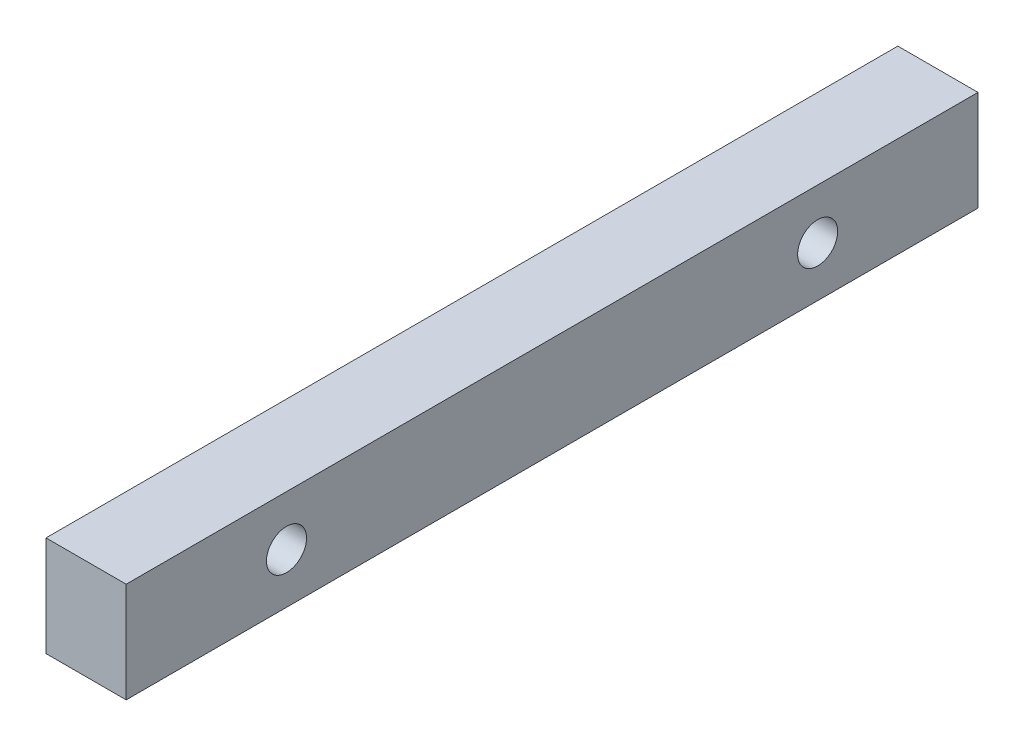
ISO-10303-21;
HEADER;
FILE_DESCRIPTION(('STEP AP214'),'2;1');
FILE_NAME('part.step','',(''),(''),'','','');
FILE_SCHEMA(('AUTOMOTIVE_DESIGN { 1 0 10303 214 1 1 1 1 }'));
ENDSEC;
DATA;
#1=APPLICATION_CONTEXT('core data for automotive mechanical design processes');
#2=APPLICATION_PROTOCOL_DEFINITION('international standard','automotive_design',2000,#1);
#3=PRODUCT_CONTEXT('',#1,'mechanical');
#4=PRODUCT('Part','Part','',(#3));
#5=PRODUCT_RELATED_PRODUCT_CATEGORY('part','',(#4));
#6=PRODUCT_DEFINITION_FORMATION('','',#4);
#7=PRODUCT_DEFINITION_CONTEXT('part definition',#1,'design');
#8=PRODUCT_DEFINITION('design','',#6,#7);
#9=PRODUCT_DEFINITION_SHAPE('','',#8);
#10=(LENGTH_UNIT() NAMED_UNIT(*) SI_UNIT(.MILLI.,.METRE.));
#11=(NAMED_UNIT(*) PLANE_ANGLE_UNIT() SI_UNIT($,.RADIAN.));
#12=(NAMED_UNIT(*) SI_UNIT($,.STERADIAN.) SOLID_ANGLE_UNIT());
#13=UNCERTAINTY_MEASURE_WITH_UNIT(LENGTH_MEASURE(1.E-05),#10,'distance_accuracy_value','');
#14=(GEOMETRIC_REPRESENTATION_CONTEXT(3) GLOBAL_UNCERTAINTY_ASSIGNED_CONTEXT((#13)) GLOBAL_UNIT_ASSIGNED_CONTEXT((#10,
#11,#12)) REPRESENTATION_CONTEXT('',''));
#15=CARTESIAN_POINT('',(0.,0.,0.));
#16=DIRECTION('',(0.,0.,1.));
#17=DIRECTION('',(1.,0.,0.));
#18=AXIS2_PLACEMENT_3D('',#15,#16,#17);
#19=CARTESIAN_POINT('',(30.,-20.,212.5));
#20=DIRECTION('',(-1.,0.,0.));
#21=DIRECTION('',(0.,0.,1.));
#22=AXIS2_PLACEMENT_3D('',#19,#20,#21);
#23=PLANE('',#22);
#24=CARTESIAN_POINT('',(30.,5.,132.5));
#25=DIRECTION('',(1.,0.,0.));
#26=DIRECTION('',(0.,0.,-1.));
#27=AXIS2_PLACEMENT_3D('',#24,#25,#26);
#28=CIRCLE('',#27,10.);
#29=CARTESIAN_POINT('',(30.,5.,122.5));
#30=VERTEX_POINT('',#29);
#31=EDGE_CURVE('E115',#30,#30,#28,.T.);
#32=ORIENTED_EDGE('',*,*,#31,.F.);
#33=EDGE_LOOP('',(#32));
#34=FACE_BOUND('',#33,.T.);
#35=CARTESIAN_POINT('',(30.,5.,-132.5));
#36=DIRECTION('',(1.,0.,0.));
#37=DIRECTION('',(0.,0.,-1.));
#38=AXIS2_PLACEMENT_3D('',#35,#36,#37);
#39=CIRCLE('',#38,10.);
#40=CARTESIAN_POINT('',(30.,5.,-142.5));
#41=VERTEX_POINT('',#40);
#42=EDGE_CURVE('E116',#41,#41,#39,.T.);
#43=ORIENTED_EDGE('',*,*,#42,.F.);
#44=EDGE_LOOP('',(#43));
#45=FACE_BOUND('',#44,.T.);
#46=DIRECTION('',(0.,1.,0.));
#47=VECTOR('',#46,1.);
#48=CARTESIAN_POINT('',(30.,-20.,-212.5));
#49=LINE('',#48,#47);
#50=CARTESIAN_POINT('',(30.,-20.,-212.5));
#51=VERTEX_POINT('',#50);
#52=CARTESIAN_POINT('',(30.,30.,-212.5));
#53=VERTEX_POINT('',#52);
#54=EDGE_CURVE('E98',#51,#53,#49,.T.);
#55=ORIENTED_EDGE('',*,*,#54,.T.);
#56=DIRECTION('',(0.,0.,-1.));
#57=VECTOR('',#56,1.);
#58=CARTESIAN_POINT('',(30.,30.,212.5));
#59=LINE('',#58,#57);
#60=CARTESIAN_POINT('',(30.,30.,212.5));
#61=VERTEX_POINT('',#60);
#62=EDGE_CURVE('E11',#61,#53,#59,.T.);
#63=ORIENTED_EDGE('',*,*,#62,.F.);
#64=DIRECTION('',(0.,1.,0.));
#65=VECTOR('',#64,1.);
#66=CARTESIAN_POINT('',(30.,-20.,212.5));
#67=LINE('',#66,#65);
#68=CARTESIAN_POINT('',(30.,-20.,212.5));
#69=VERTEX_POINT('',#68);
#70=EDGE_CURVE('E86',#69,#61,#67,.T.);
#71=ORIENTED_EDGE('',*,*,#70,.F.);
#72=DIRECTION('',(0.,0.,-1.));
#73=VECTOR('',#72,1.);
#74=CARTESIAN_POINT('',(30.,-20.,212.5));
#75=LINE('',#74,#73);
#76=EDGE_CURVE('E94',#69,#51,#75,.T.);
#77=ORIENTED_EDGE('',*,*,#76,.T.);
#78=EDGE_LOOP('',(#55,#63,#71,#77));
#79=FACE_BOUND('',#78,.T.);
#80=ADVANCED_FACE('F35',(#34,#45,#79),#23,.F.);
#81=CARTESIAN_POINT('',(-10.,30.,212.5));
#82=DIRECTION('',(0.,-1.,0.));
#83=DIRECTION('',(0.,0.,-1.));
#84=AXIS2_PLACEMENT_3D('',#81,#82,#83);
#85=PLANE('',#84);
#86=DIRECTION('',(-1.,0.,0.));
#87=VECTOR('',#86,1.);
#88=CARTESIAN_POINT('',(-10.,30.,-212.5));
#89=LINE('',#88,#87);
#90=CARTESIAN_POINT('',(-10.,30.,-212.5));
#91=VERTEX_POINT('',#90);
#92=EDGE_CURVE('E90',#53,#91,#89,.T.);
#93=ORIENTED_EDGE('',*,*,#92,.T.);
#94=DIRECTION('',(0.,0.,-1.));
#95=VECTOR('',#94,1.);
#96=CARTESIAN_POINT('',(-10.,30.,212.5));
#97=LINE('',#96,#95);
#98=CARTESIAN_POINT('',(-10.,30.,212.5));
#99=VERTEX_POINT('',#98);
#100=EDGE_CURVE('E43',#99,#91,#97,.T.);
#101=ORIENTED_EDGE('',*,*,#100,.F.);
#102=DIRECTION('',(-1.,0.,0.));
#103=VECTOR('',#102,1.);
#104=CARTESIAN_POINT('',(-10.,30.,212.5));
#105=LINE('',#104,#103);
#106=EDGE_CURVE('E81',#61,#99,#105,.T.);
#107=ORIENTED_EDGE('',*,*,#106,.F.);
#108=ORIENTED_EDGE('',*,*,#62,.T.);
#109=EDGE_LOOP('',(#93,#101,#107,#108));
#110=FACE_BOUND('',#109,.T.);
#111=ADVANCED_FACE('F89',(#110),#85,.F.);
#112=CARTESIAN_POINT('',(-10.,-20.,212.5));
#113=DIRECTION('',(1.,0.,0.));
#114=DIRECTION('',(0.,0.,-1.));
#115=AXIS2_PLACEMENT_3D('',#112,#113,#114);
#116=PLANE('',#115);
#117=CARTESIAN_POINT('',(-10.,5.,132.5));
#118=DIRECTION('',(1.,0.,0.));
#119=DIRECTION('',(0.,0.,-1.));
#120=AXIS2_PLACEMENT_3D('',#117,#118,#119);
#121=CIRCLE('',#120,10.);
#122=CARTESIAN_POINT('',(-10.,5.,122.5));
#123=VERTEX_POINT('',#122);
#124=EDGE_CURVE('E101',#123,#123,#121,.F.);
#125=ORIENTED_EDGE('',*,*,#124,.F.);
#126=EDGE_LOOP('',(#125));
#127=FACE_BOUND('',#126,.T.);
#128=CARTESIAN_POINT('',(-10.,5.,-132.5));
#129=DIRECTION('',(1.,0.,0.));
#130=DIRECTION('',(0.,0.,-1.));
#131=AXIS2_PLACEMENT_3D('',#128,#129,#130);
#132=CIRCLE('',#131,10.);
#133=CARTESIAN_POINT('',(-10.,5.,-142.5));
#134=VERTEX_POINT('',#133);
#135=EDGE_CURVE('E112',#134,#134,#132,.F.);
#136=ORIENTED_EDGE('',*,*,#135,.F.);
#137=EDGE_LOOP('',(#136));
#138=FACE_BOUND('',#137,.T.);
#139=DIRECTION('',(0.,-1.,0.));
#140=VECTOR('',#139,1.);
#141=CARTESIAN_POINT('',(-10.,-20.,-212.5));
#142=LINE('',#141,#140);
#143=CARTESIAN_POINT('',(-10.,-20.,-212.5));
#144=VERTEX_POINT('',#143);
#145=EDGE_CURVE('E68',#91,#144,#142,.T.);
#146=ORIENTED_EDGE('',*,*,#145,.T.);
#147=DIRECTION('',(0.,0.,-1.));
#148=VECTOR('',#147,1.);
#149=CARTESIAN_POINT('',(-10.,-20.,212.5));
#150=LINE('',#149,#148);
#151=CARTESIAN_POINT('',(-10.,-20.,212.5));
#152=VERTEX_POINT('',#151);
#153=EDGE_CURVE('E91',#152,#144,#150,.T.);
#154=ORIENTED_EDGE('',*,*,#153,.F.);
#155=DIRECTION('',(0.,-1.,0.));
#156=VECTOR('',#155,1.);
#157=CARTESIAN_POINT('',(-10.,-20.,212.5));
#158=LINE('',#157,#156);
#159=EDGE_CURVE('E84',#99,#152,#158,.T.);
#160=ORIENTED_EDGE('',*,*,#159,.F.);
#161=ORIENTED_EDGE('',*,*,#100,.T.);
#162=EDGE_LOOP('',(#146,#154,#160,#161));
#163=FACE_BOUND('',#162,.T.);
#164=ADVANCED_FACE('F92',(#127,#138,#163),#116,.F.);
#165=CARTESIAN_POINT('',(-10.,-20.,212.5));
#166=DIRECTION('',(0.,1.,0.));
#167=DIRECTION('',(0.,0.,1.));
#168=AXIS2_PLACEMENT_3D('',#165,#166,#167);
#169=PLANE('',#168);
#170=DIRECTION('',(1.,0.,0.));
#171=VECTOR('',#170,1.);
#172=CARTESIAN_POINT('',(-10.,-20.,-212.5));
#173=LINE('',#172,#171);
#174=EDGE_CURVE('E74',#144,#51,#173,.T.);
#175=ORIENTED_EDGE('',*,*,#174,.T.);
#176=ORIENTED_EDGE('',*,*,#76,.F.);
#177=DIRECTION('',(1.,0.,0.));
#178=VECTOR('',#177,1.);
#179=CARTESIAN_POINT('',(-10.,-20.,212.5));
#180=LINE('',#179,#178);
#181=EDGE_CURVE('E51',#152,#69,#180,.T.);
#182=ORIENTED_EDGE('',*,*,#181,.F.);
#183=ORIENTED_EDGE('',*,*,#153,.T.);
#184=EDGE_LOOP('',(#175,#176,#182,#183));
#185=FACE_BOUND('',#184,.T.);
#186=ADVANCED_FACE('F106',(#185),#169,.F.);
#187=CARTESIAN_POINT('',(0.,0.,212.5));
#188=DIRECTION('',(0.,0.,-1.));
#189=DIRECTION('',(-1.,0.,0.));
#190=AXIS2_PLACEMENT_3D('',#187,#188,#189);
#191=PLANE('',#190);
#192=ORIENTED_EDGE('',*,*,#70,.T.);
#193=ORIENTED_EDGE('',*,*,#106,.T.);
#194=ORIENTED_EDGE('',*,*,#159,.T.);
#195=ORIENTED_EDGE('',*,*,#181,.T.);
#196=EDGE_LOOP('',(#192,#193,#194,#195));
#197=FACE_BOUND('',#196,.T.);
#198=ADVANCED_FACE('F82',(#197),#191,.F.);
#199=CARTESIAN_POINT('',(0.,0.,-212.5));
#200=DIRECTION('',(0.,0.,-1.));
#201=DIRECTION('',(-1.,0.,0.));
#202=AXIS2_PLACEMENT_3D('',#199,#200,#201);
#203=PLANE('',#202);
#204=ORIENTED_EDGE('',*,*,#54,.F.);
#205=ORIENTED_EDGE('',*,*,#174,.F.);
#206=ORIENTED_EDGE('',*,*,#145,.F.);
#207=ORIENTED_EDGE('',*,*,#92,.F.);
#208=EDGE_LOOP('',(#204,#205,#206,#207));
#209=FACE_BOUND('',#208,.T.);
#210=ADVANCED_FACE('F109',(#209),#203,.T.);
#211=CARTESIAN_POINT('',(-10.001,5.,-132.5));
#212=DIRECTION('',(1.,0.,0.));
#213=DIRECTION('',(0.,0.,-1.));
#214=AXIS2_PLACEMENT_3D('',#211,#212,#213);
#215=CYLINDRICAL_SURFACE('',#214,10.);
#216=ORIENTED_EDGE('',*,*,#42,.T.);
#217=EDGE_LOOP('',(#216));
#218=FACE_BOUND('',#217,.T.);
#219=ORIENTED_EDGE('',*,*,#135,.T.);
#220=EDGE_LOOP('',(#219));
#221=FACE_BOUND('',#220,.T.);
#222=ADVANCED_FACE('F131',(#218,#221),#215,.F.);
#223=CARTESIAN_POINT('',(-10.001,5.,132.5));
#224=DIRECTION('',(1.,0.,0.));
#225=DIRECTION('',(0.,0.,-1.));
#226=AXIS2_PLACEMENT_3D('',#223,#224,#225);
#227=CYLINDRICAL_SURFACE('',#226,10.);
#228=ORIENTED_EDGE('',*,*,#31,.T.);
#229=EDGE_LOOP('',(#228));
#230=FACE_BOUND('',#229,.T.);
#231=ORIENTED_EDGE('',*,*,#124,.T.);
#232=EDGE_LOOP('',(#231));
#233=FACE_BOUND('',#232,.T.);
#234=ADVANCED_FACE('F124',(#230,#233),#227,.F.);
#235=CLOSED_SHELL('',(#80,#111,#164,#186,#198,#210,#222,#234));
#236=MANIFOLD_SOLID_BREP('B2',#235);
#237=ADVANCED_BREP_SHAPE_REPRESENTATION('',(#18,#236),#14);
#238=SHAPE_DEFINITION_REPRESENTATION(#9,#237);
ENDSEC;
END-ISO-10303-21;
